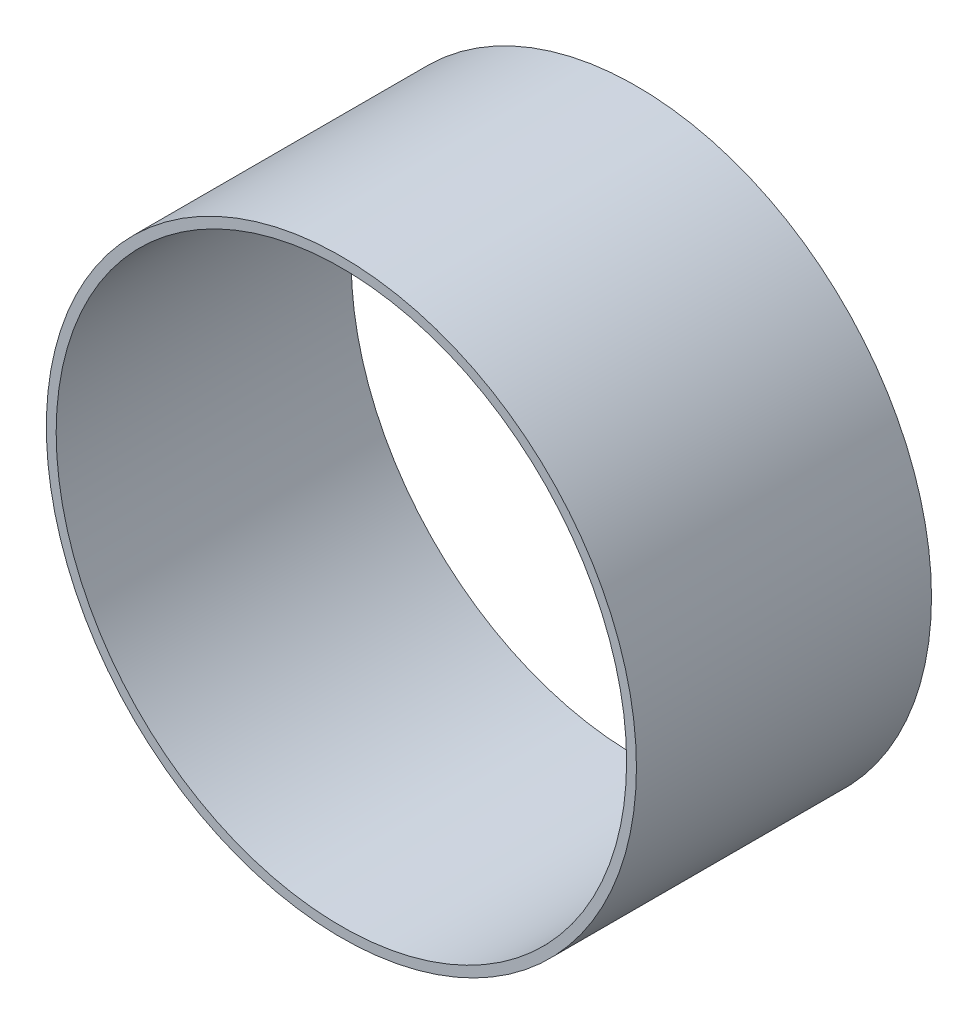
ISO-10303-21;
HEADER;
FILE_DESCRIPTION(('STEP AP214'),'2;1');
FILE_NAME('part.step','',(''),(''),'','','');
FILE_SCHEMA(('AUTOMOTIVE_DESIGN { 1 0 10303 214 1 1 1 1 }'));
ENDSEC;
DATA;
#1=APPLICATION_CONTEXT('core data for automotive mechanical design processes');
#2=APPLICATION_PROTOCOL_DEFINITION('international standard','automotive_design',2000,#1);
#3=PRODUCT_CONTEXT('',#1,'mechanical');
#4=PRODUCT('Part','Part','',(#3));
#5=PRODUCT_RELATED_PRODUCT_CATEGORY('part','',(#4));
#6=PRODUCT_DEFINITION_FORMATION('','',#4);
#7=PRODUCT_DEFINITION_CONTEXT('part definition',#1,'design');
#8=PRODUCT_DEFINITION('design','',#6,#7);
#9=PRODUCT_DEFINITION_SHAPE('','',#8);
#10=(LENGTH_UNIT() NAMED_UNIT(*) SI_UNIT(.MILLI.,.METRE.));
#11=(NAMED_UNIT(*) PLANE_ANGLE_UNIT() SI_UNIT($,.RADIAN.));
#12=(NAMED_UNIT(*) SI_UNIT($,.STERADIAN.) SOLID_ANGLE_UNIT());
#13=UNCERTAINTY_MEASURE_WITH_UNIT(LENGTH_MEASURE(1.E-05),#10,'distance_accuracy_value','');
#14=(GEOMETRIC_REPRESENTATION_CONTEXT(3) GLOBAL_UNCERTAINTY_ASSIGNED_CONTEXT((#13)) GLOBAL_UNIT_ASSIGNED_CONTEXT((#10,
#11,#12)) REPRESENTATION_CONTEXT('',''));
#15=CARTESIAN_POINT('',(0.,0.,0.));
#16=DIRECTION('',(0.,0.,1.));
#17=DIRECTION('',(1.,0.,0.));
#18=AXIS2_PLACEMENT_3D('',#15,#16,#17);
#19=CARTESIAN_POINT('',(0.,0.,120.));
#20=DIRECTION('',(0.,0.,1.));
#21=DIRECTION('',(1.,0.,0.));
#22=AXIS2_PLACEMENT_3D('',#19,#20,#21);
#23=PLANE('',#22);
#24=CARTESIAN_POINT('',(0.,0.,120.));
#25=DIRECTION('',(0.,0.,1.));
#26=DIRECTION('',(1.,0.,0.));
#27=AXIS2_PLACEMENT_3D('',#24,#25,#26);
#28=CIRCLE('',#27,120.);
#29=CARTESIAN_POINT('',(120.,0.,120.));
#30=VERTEX_POINT('',#29);
#31=EDGE_CURVE('E10',#30,#30,#28,.T.);
#32=ORIENTED_EDGE('',*,*,#31,.T.);
#33=EDGE_LOOP('',(#32));
#34=FACE_BOUND('',#33,.T.);
#35=CARTESIAN_POINT('',(0.,0.,120.));
#36=DIRECTION('',(0.,0.,1.));
#37=DIRECTION('',(1.,0.,0.));
#38=AXIS2_PLACEMENT_3D('',#35,#36,#37);
#39=CIRCLE('',#38,116.);
#40=CARTESIAN_POINT('',(116.,0.,120.));
#41=VERTEX_POINT('',#40);
#42=EDGE_CURVE('E52',#41,#41,#39,.T.);
#43=ORIENTED_EDGE('',*,*,#42,.F.);
#44=EDGE_LOOP('',(#43));
#45=FACE_BOUND('',#44,.T.);
#46=ADVANCED_FACE('F39',(#34,#45),#23,.T.);
#47=CARTESIAN_POINT('',(0.,0.,0.));
#48=DIRECTION('',(0.,0.,1.));
#49=DIRECTION('',(1.,0.,0.));
#50=AXIS2_PLACEMENT_3D('',#47,#48,#49);
#51=PLANE('',#50);
#52=CARTESIAN_POINT('',(0.,0.,0.));
#53=DIRECTION('',(0.,0.,1.));
#54=DIRECTION('',(1.,0.,0.));
#55=AXIS2_PLACEMENT_3D('',#52,#53,#54);
#56=CIRCLE('',#55,120.);
#57=CARTESIAN_POINT('',(120.,0.,0.));
#58=VERTEX_POINT('',#57);
#59=EDGE_CURVE('E43',#58,#58,#56,.T.);
#60=ORIENTED_EDGE('',*,*,#59,.F.);
#61=EDGE_LOOP('',(#60));
#62=FACE_BOUND('',#61,.T.);
#63=CARTESIAN_POINT('',(0.,0.,0.));
#64=DIRECTION('',(0.,0.,1.));
#65=DIRECTION('',(1.,0.,0.));
#66=AXIS2_PLACEMENT_3D('',#63,#64,#65);
#67=CIRCLE('',#66,116.);
#68=CARTESIAN_POINT('',(116.,0.,0.));
#69=VERTEX_POINT('',#68);
#70=EDGE_CURVE('E54',#69,#69,#67,.T.);
#71=ORIENTED_EDGE('',*,*,#70,.T.);
#72=EDGE_LOOP('',(#71));
#73=FACE_BOUND('',#72,.T.);
#74=ADVANCED_FACE('F66',(#62,#73),#51,.F.);
#75=CARTESIAN_POINT('',(0.,0.,120.));
#76=DIRECTION('',(0.,0.,-1.));
#77=DIRECTION('',(-1.,0.,0.));
#78=AXIS2_PLACEMENT_3D('',#75,#76,#77);
#79=CYLINDRICAL_SURFACE('',#78,120.);
#80=ORIENTED_EDGE('',*,*,#31,.F.);
#81=EDGE_LOOP('',(#80));
#82=FACE_BOUND('',#81,.T.);
#83=ORIENTED_EDGE('',*,*,#59,.T.);
#84=EDGE_LOOP('',(#83));
#85=FACE_BOUND('',#84,.T.);
#86=ADVANCED_FACE('F41',(#82,#85),#79,.T.);
#87=CARTESIAN_POINT('',(0.,0.,120.));
#88=DIRECTION('',(0.,0.,-1.));
#89=DIRECTION('',(-1.,0.,0.));
#90=AXIS2_PLACEMENT_3D('',#87,#88,#89);
#91=CYLINDRICAL_SURFACE('',#90,116.);
#92=ORIENTED_EDGE('',*,*,#42,.T.);
#93=EDGE_LOOP('',(#92));
#94=FACE_BOUND('',#93,.T.);
#95=ORIENTED_EDGE('',*,*,#70,.F.);
#96=EDGE_LOOP('',(#95));
#97=FACE_BOUND('',#96,.T.);
#98=ADVANCED_FACE('F62',(#94,#97),#91,.F.);
#99=CLOSED_SHELL('',(#46,#74,#86,#98));
#100=MANIFOLD_SOLID_BREP('B2',#99);
#101=ADVANCED_BREP_SHAPE_REPRESENTATION('',(#18,#100),#14);
#102=SHAPE_DEFINITION_REPRESENTATION(#9,#101);
ENDSEC;
END-ISO-10303-21;
